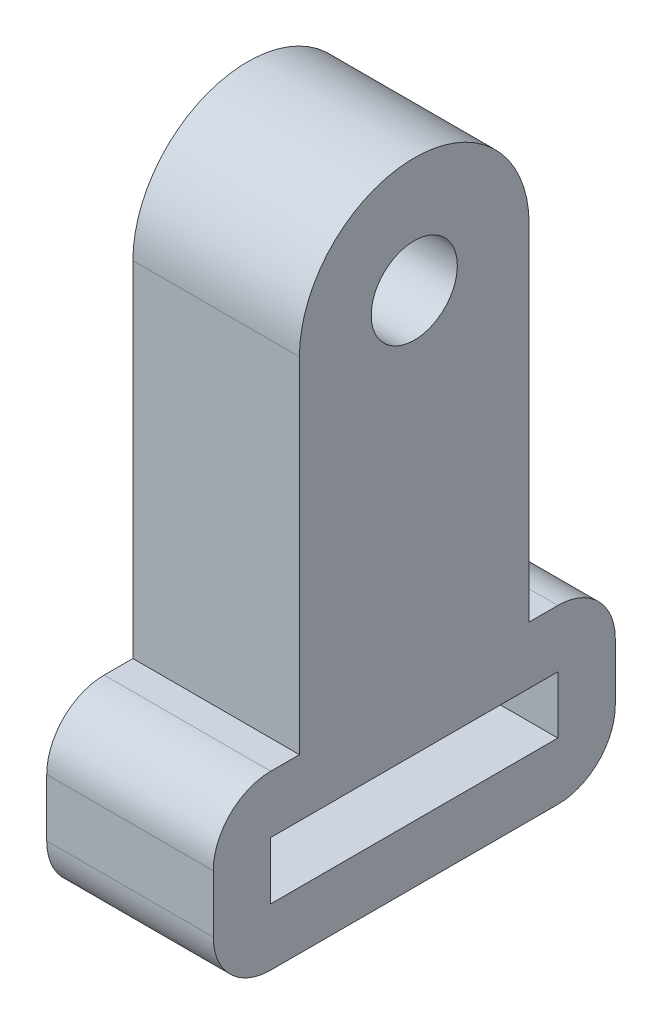
ISO-10303-21;
HEADER;
FILE_DESCRIPTION(('STEP AP214'),'2;1');
FILE_NAME('part.step','',(''),(''),'','','');
FILE_SCHEMA(('AUTOMOTIVE_DESIGN { 1 0 10303 214 1 1 1 1 }'));
ENDSEC;
DATA;
#1=APPLICATION_CONTEXT('core data for automotive mechanical design processes');
#2=APPLICATION_PROTOCOL_DEFINITION('international standard','automotive_design',2000,#1);
#3=PRODUCT_CONTEXT('',#1,'mechanical');
#4=PRODUCT('Part','Part','',(#3));
#5=PRODUCT_RELATED_PRODUCT_CATEGORY('part','',(#4));
#6=PRODUCT_DEFINITION_FORMATION('','',#4);
#7=PRODUCT_DEFINITION_CONTEXT('part definition',#1,'design');
#8=PRODUCT_DEFINITION('design','',#6,#7);
#9=PRODUCT_DEFINITION_SHAPE('','',#8);
#10=(LENGTH_UNIT() NAMED_UNIT(*) SI_UNIT(.MILLI.,.METRE.));
#11=(NAMED_UNIT(*) PLANE_ANGLE_UNIT() SI_UNIT($,.RADIAN.));
#12=(NAMED_UNIT(*) SI_UNIT($,.STERADIAN.) SOLID_ANGLE_UNIT());
#13=UNCERTAINTY_MEASURE_WITH_UNIT(LENGTH_MEASURE(1.E-05),#10,'distance_accuracy_value','');
#14=(GEOMETRIC_REPRESENTATION_CONTEXT(3) GLOBAL_UNCERTAINTY_ASSIGNED_CONTEXT((#13)) GLOBAL_UNIT_ASSIGNED_CONTEXT((#10,
#11,#12)) REPRESENTATION_CONTEXT('',''));
#15=CARTESIAN_POINT('',(0.,0.,0.));
#16=DIRECTION('',(0.,0.,1.));
#17=DIRECTION('',(1.,0.,0.));
#18=AXIS2_PLACEMENT_3D('',#15,#16,#17);
#19=CARTESIAN_POINT('',(2.9,-0.999999999999999,-5.));
#20=DIRECTION('',(1.,0.,0.));
#21=DIRECTION('',(0.,0.,-1.));
#22=AXIS2_PLACEMENT_3D('',#19,#20,#21);
#23=PLANE('',#22);
#24=DIRECTION('',(0.,0.,1.));
#25=VECTOR('',#24,1.);
#26=CARTESIAN_POINT('',(2.9,1.,5.));
#27=LINE('',#26,#25);
#28=CARTESIAN_POINT('',(2.9,1.,-5.));
#29=VERTEX_POINT('',#28);
#30=CARTESIAN_POINT('',(2.9,1.,5.));
#31=VERTEX_POINT('',#30);
#32=EDGE_CURVE('E154',#29,#31,#27,.T.);
#33=ORIENTED_EDGE('',*,*,#32,.F.);
#34=DIRECTION('',(0.,1.,0.));
#35=VECTOR('',#34,1.);
#36=CARTESIAN_POINT('',(2.9,1.,-5.));
#37=LINE('',#36,#35);
#38=CARTESIAN_POINT('',(2.9,-0.999999999999999,-5.));
#39=VERTEX_POINT('',#38);
#40=EDGE_CURVE('E146',#39,#29,#37,.T.);
#41=ORIENTED_EDGE('',*,*,#40,.F.);
#42=DIRECTION('',(0.,0.,-1.));
#43=VECTOR('',#42,1.);
#44=CARTESIAN_POINT('',(2.9,-1.,5.));
#45=LINE('',#44,#43);
#46=CARTESIAN_POINT('',(2.9,-1.,5.));
#47=VERTEX_POINT('',#46);
#48=EDGE_CURVE('E169',#47,#39,#45,.T.);
#49=ORIENTED_EDGE('',*,*,#48,.F.);
#50=DIRECTION('',(0.,-1.,0.));
#51=VECTOR('',#50,1.);
#52=CARTESIAN_POINT('',(2.9,1.,5.));
#53=LINE('',#52,#51);
#54=EDGE_CURVE('E167',#31,#47,#53,.T.);
#55=ORIENTED_EDGE('',*,*,#54,.F.);
#56=EDGE_LOOP('',(#33,#41,#49,#55));
#57=FACE_BOUND('',#56,.T.);
#58=CARTESIAN_POINT('',(2.9,-0.999999999999999,-5.));
#59=DIRECTION('',(1.,0.,0.));
#60=DIRECTION('',(0.,0.,-1.));
#61=AXIS2_PLACEMENT_3D('',#58,#59,#60);
#62=CIRCLE('',#61,2.);
#63=CARTESIAN_POINT('',(2.9,-3.,-5.));
#64=VERTEX_POINT('',#63);
#65=CARTESIAN_POINT('',(2.9,-0.999999999999999,-7.));
#66=VERTEX_POINT('',#65);
#67=EDGE_CURVE('E185',#64,#66,#62,.T.);
#68=ORIENTED_EDGE('',*,*,#67,.T.);
#69=DIRECTION('',(0.,1.,0.));
#70=VECTOR('',#69,1.);
#71=CARTESIAN_POINT('',(2.9,1.,-7.));
#72=LINE('',#71,#70);
#73=CARTESIAN_POINT('',(2.9,1.,-7.));
#74=VERTEX_POINT('',#73);
#75=EDGE_CURVE('E188',#66,#74,#72,.T.);
#76=ORIENTED_EDGE('',*,*,#75,.T.);
#77=CARTESIAN_POINT('',(2.9,1.,-5.));
#78=DIRECTION('',(1.,0.,0.));
#79=DIRECTION('',(0.,0.,1.));
#80=AXIS2_PLACEMENT_3D('',#77,#78,#79);
#81=CIRCLE('',#80,2.);
#82=CARTESIAN_POINT('',(2.9,3.,-5.));
#83=VERTEX_POINT('',#82);
#84=EDGE_CURVE('E191',#74,#83,#81,.T.);
#85=ORIENTED_EDGE('',*,*,#84,.T.);
#86=DIRECTION('',(0.,0.,1.));
#87=VECTOR('',#86,1.);
#88=CARTESIAN_POINT('',(2.9,3.,-4.));
#89=LINE('',#88,#87);
#90=CARTESIAN_POINT('',(2.9,3.,-4.));
#91=VERTEX_POINT('',#90);
#92=EDGE_CURVE('E193',#83,#91,#89,.T.);
#93=ORIENTED_EDGE('',*,*,#92,.T.);
#94=DIRECTION('',(0.,1.,0.));
#95=VECTOR('',#94,1.);
#96=CARTESIAN_POINT('',(2.9,15.,-4.));
#97=LINE('',#96,#95);
#98=CARTESIAN_POINT('',(2.9,15.,-4.));
#99=VERTEX_POINT('',#98);
#100=EDGE_CURVE('E195',#91,#99,#97,.T.);
#101=ORIENTED_EDGE('',*,*,#100,.T.);
#102=CARTESIAN_POINT('',(2.9,15.,0.));
#103=DIRECTION('',(1.,0.,0.));
#104=DIRECTION('',(0.,0.,-1.));
#105=AXIS2_PLACEMENT_3D('',#102,#103,#104);
#106=CIRCLE('',#105,4.);
#107=CARTESIAN_POINT('',(2.9,15.,4.));
#108=VERTEX_POINT('',#107);
#109=EDGE_CURVE('E197',#99,#108,#106,.T.);
#110=ORIENTED_EDGE('',*,*,#109,.T.);
#111=DIRECTION('',(0.,-1.,0.));
#112=VECTOR('',#111,1.);
#113=CARTESIAN_POINT('',(2.9,15.,4.));
#114=LINE('',#113,#112);
#115=CARTESIAN_POINT('',(2.9,3.,4.));
#116=VERTEX_POINT('',#115);
#117=EDGE_CURVE('E199',#108,#116,#114,.T.);
#118=ORIENTED_EDGE('',*,*,#117,.T.);
#119=DIRECTION('',(0.,0.,1.));
#120=VECTOR('',#119,1.);
#121=CARTESIAN_POINT('',(2.9,3.,4.));
#122=LINE('',#121,#120);
#123=CARTESIAN_POINT('',(2.9,3.,5.));
#124=VERTEX_POINT('',#123);
#125=EDGE_CURVE('E201',#116,#124,#122,.T.);
#126=ORIENTED_EDGE('',*,*,#125,.T.);
#127=CARTESIAN_POINT('',(2.9,1.,5.));
#128=DIRECTION('',(1.,0.,0.));
#129=DIRECTION('',(0.,0.,-1.));
#130=AXIS2_PLACEMENT_3D('',#127,#128,#129);
#131=CIRCLE('',#130,2.);
#132=CARTESIAN_POINT('',(2.9,1.,7.));
#133=VERTEX_POINT('',#132);
#134=EDGE_CURVE('E203',#124,#133,#131,.T.);
#135=ORIENTED_EDGE('',*,*,#134,.T.);
#136=DIRECTION('',(0.,-1.,0.));
#137=VECTOR('',#136,1.);
#138=CARTESIAN_POINT('',(2.9,1.,7.));
#139=LINE('',#138,#137);
#140=CARTESIAN_POINT('',(2.9,-0.999999999999999,7.));
#141=VERTEX_POINT('',#140);
#142=EDGE_CURVE('E205',#133,#141,#139,.T.);
#143=ORIENTED_EDGE('',*,*,#142,.T.);
#144=CARTESIAN_POINT('',(2.9,-0.999999999999999,5.));
#145=DIRECTION('',(1.,0.,0.));
#146=DIRECTION('',(0.,0.,-1.));
#147=AXIS2_PLACEMENT_3D('',#144,#145,#146);
#148=CIRCLE('',#147,2.);
#149=CARTESIAN_POINT('',(2.9,-3.,5.));
#150=VERTEX_POINT('',#149);
#151=EDGE_CURVE('E207',#141,#150,#148,.T.);
#152=ORIENTED_EDGE('',*,*,#151,.T.);
#153=DIRECTION('',(0.,0.,-1.));
#154=VECTOR('',#153,1.);
#155=CARTESIAN_POINT('',(2.9,-3.,5.));
#156=LINE('',#155,#154);
#157=EDGE_CURVE('E209',#150,#64,#156,.T.);
#158=ORIENTED_EDGE('',*,*,#157,.T.);
#159=EDGE_LOOP('',(#68,#76,#85,#93,#101,#110,#118,#126,#135,#143,#152,#158));
#160=FACE_BOUND('',#159,.T.);
#161=CARTESIAN_POINT('',(2.9,15.,0.));
#162=DIRECTION('',(1.,0.,0.));
#163=DIRECTION('',(0.,0.,-1.));
#164=AXIS2_PLACEMENT_3D('',#161,#162,#163);
#165=CIRCLE('',#164,1.5);
#166=CARTESIAN_POINT('',(2.9,15.,-1.5));
#167=VERTEX_POINT('',#166);
#168=EDGE_CURVE('E175',#167,#167,#165,.T.);
#169=ORIENTED_EDGE('',*,*,#168,.F.);
#170=EDGE_LOOP('',(#169));
#171=FACE_BOUND('',#170,.T.);
#172=ADVANCED_FACE('F33',(#57,#160,#171),#23,.T.);
#173=CARTESIAN_POINT('',(-2.9,-0.999999999999999,-5.));
#174=DIRECTION('',(1.,0.,0.));
#175=DIRECTION('',(0.,0.,-1.));
#176=AXIS2_PLACEMENT_3D('',#173,#174,#175);
#177=PLANE('',#176);
#178=CARTESIAN_POINT('',(-2.9,-0.999999999999999,-5.));
#179=DIRECTION('',(1.,0.,0.));
#180=DIRECTION('',(0.,0.,-1.));
#181=AXIS2_PLACEMENT_3D('',#178,#179,#180);
#182=CIRCLE('',#181,2.);
#183=CARTESIAN_POINT('',(-2.9,-3.,-5.));
#184=VERTEX_POINT('',#183);
#185=CARTESIAN_POINT('',(-2.9,-0.999999999999999,-7.));
#186=VERTEX_POINT('',#185);
#187=EDGE_CURVE('E162',#184,#186,#182,.T.);
#188=ORIENTED_EDGE('',*,*,#187,.F.);
#189=DIRECTION('',(0.,0.,-1.));
#190=VECTOR('',#189,1.);
#191=CARTESIAN_POINT('',(-2.9,-3.,5.));
#192=LINE('',#191,#190);
#193=CARTESIAN_POINT('',(-2.9,-3.,5.));
#194=VERTEX_POINT('',#193);
#195=EDGE_CURVE('E189',#194,#184,#192,.T.);
#196=ORIENTED_EDGE('',*,*,#195,.F.);
#197=CARTESIAN_POINT('',(-2.9,-0.999999999999999,5.));
#198=DIRECTION('',(1.,0.,0.));
#199=DIRECTION('',(0.,0.,-1.));
#200=AXIS2_PLACEMENT_3D('',#197,#198,#199);
#201=CIRCLE('',#200,2.);
#202=CARTESIAN_POINT('',(-2.9,-0.999999999999999,7.));
#203=VERTEX_POINT('',#202);
#204=EDGE_CURVE('E232',#203,#194,#201,.T.);
#205=ORIENTED_EDGE('',*,*,#204,.F.);
#206=DIRECTION('',(0.,-1.,0.));
#207=VECTOR('',#206,1.);
#208=CARTESIAN_POINT('',(-2.9,1.,7.));
#209=LINE('',#208,#207);
#210=CARTESIAN_POINT('',(-2.9,1.,7.));
#211=VERTEX_POINT('',#210);
#212=EDGE_CURVE('E230',#211,#203,#209,.T.);
#213=ORIENTED_EDGE('',*,*,#212,.F.);
#214=CARTESIAN_POINT('',(-2.9,1.,5.));
#215=DIRECTION('',(1.,0.,0.));
#216=DIRECTION('',(0.,0.,-1.));
#217=AXIS2_PLACEMENT_3D('',#214,#215,#216);
#218=CIRCLE('',#217,2.);
#219=CARTESIAN_POINT('',(-2.9,3.,5.));
#220=VERTEX_POINT('',#219);
#221=EDGE_CURVE('E228',#220,#211,#218,.T.);
#222=ORIENTED_EDGE('',*,*,#221,.F.);
#223=DIRECTION('',(0.,0.,1.));
#224=VECTOR('',#223,1.);
#225=CARTESIAN_POINT('',(-2.9,3.,4.));
#226=LINE('',#225,#224);
#227=CARTESIAN_POINT('',(-2.9,3.,4.));
#228=VERTEX_POINT('',#227);
#229=EDGE_CURVE('E226',#228,#220,#226,.T.);
#230=ORIENTED_EDGE('',*,*,#229,.F.);
#231=DIRECTION('',(0.,-1.,0.));
#232=VECTOR('',#231,1.);
#233=CARTESIAN_POINT('',(-2.9,15.,4.));
#234=LINE('',#233,#232);
#235=CARTESIAN_POINT('',(-2.9,15.,4.));
#236=VERTEX_POINT('',#235);
#237=EDGE_CURVE('E224',#236,#228,#234,.T.);
#238=ORIENTED_EDGE('',*,*,#237,.F.);
#239=CARTESIAN_POINT('',(-2.9,15.,0.));
#240=DIRECTION('',(1.,0.,0.));
#241=DIRECTION('',(0.,0.,-1.));
#242=AXIS2_PLACEMENT_3D('',#239,#240,#241);
#243=CIRCLE('',#242,4.);
#244=CARTESIAN_POINT('',(-2.9,15.,-4.));
#245=VERTEX_POINT('',#244);
#246=EDGE_CURVE('E222',#245,#236,#243,.T.);
#247=ORIENTED_EDGE('',*,*,#246,.F.);
#248=DIRECTION('',(0.,1.,0.));
#249=VECTOR('',#248,1.);
#250=CARTESIAN_POINT('',(-2.9,15.,-4.));
#251=LINE('',#250,#249);
#252=CARTESIAN_POINT('',(-2.9,3.,-4.));
#253=VERTEX_POINT('',#252);
#254=EDGE_CURVE('E220',#253,#245,#251,.T.);
#255=ORIENTED_EDGE('',*,*,#254,.F.);
#256=DIRECTION('',(0.,0.,1.));
#257=VECTOR('',#256,1.);
#258=CARTESIAN_POINT('',(-2.9,3.,-4.));
#259=LINE('',#258,#257);
#260=CARTESIAN_POINT('',(-2.9,3.,-5.));
#261=VERTEX_POINT('',#260);
#262=EDGE_CURVE('E218',#261,#253,#259,.T.);
#263=ORIENTED_EDGE('',*,*,#262,.F.);
#264=CARTESIAN_POINT('',(-2.9,1.,-5.));
#265=DIRECTION('',(1.,0.,0.));
#266=DIRECTION('',(0.,0.,1.));
#267=AXIS2_PLACEMENT_3D('',#264,#265,#266);
#268=CIRCLE('',#267,2.);
#269=CARTESIAN_POINT('',(-2.9,1.,-7.));
#270=VERTEX_POINT('',#269);
#271=EDGE_CURVE('E216',#270,#261,#268,.T.);
#272=ORIENTED_EDGE('',*,*,#271,.F.);
#273=DIRECTION('',(0.,1.,0.));
#274=VECTOR('',#273,1.);
#275=CARTESIAN_POINT('',(-2.9,1.,-7.));
#276=LINE('',#275,#274);
#277=EDGE_CURVE('E214',#186,#270,#276,.T.);
#278=ORIENTED_EDGE('',*,*,#277,.F.);
#279=EDGE_LOOP('',(#188,#196,#205,#213,#222,#230,#238,#247,#255,#263,#272,#278));
#280=FACE_BOUND('',#279,.T.);
#281=DIRECTION('',(0.,1.,0.));
#282=VECTOR('',#281,1.);
#283=CARTESIAN_POINT('',(-2.9,1.,-5.));
#284=LINE('',#283,#282);
#285=CARTESIAN_POINT('',(-2.9,-0.999999999999999,-5.));
#286=VERTEX_POINT('',#285);
#287=CARTESIAN_POINT('',(-2.9,1.,-5.));
#288=VERTEX_POINT('',#287);
#289=EDGE_CURVE('E56',#286,#288,#284,.T.);
#290=ORIENTED_EDGE('',*,*,#289,.T.);
#291=DIRECTION('',(0.,0.,1.));
#292=VECTOR('',#291,1.);
#293=CARTESIAN_POINT('',(-2.9,1.,5.));
#294=LINE('',#293,#292);
#295=CARTESIAN_POINT('',(-2.9,1.,5.));
#296=VERTEX_POINT('',#295);
#297=EDGE_CURVE('E161',#288,#296,#294,.T.);
#298=ORIENTED_EDGE('',*,*,#297,.T.);
#299=DIRECTION('',(0.,-1.,0.));
#300=VECTOR('',#299,1.);
#301=CARTESIAN_POINT('',(-2.9,1.,5.));
#302=LINE('',#301,#300);
#303=CARTESIAN_POINT('',(-2.9,-1.,5.));
#304=VERTEX_POINT('',#303);
#305=EDGE_CURVE('E177',#296,#304,#302,.T.);
#306=ORIENTED_EDGE('',*,*,#305,.T.);
#307=DIRECTION('',(0.,0.,-1.));
#308=VECTOR('',#307,1.);
#309=CARTESIAN_POINT('',(-2.9,-1.,5.));
#310=LINE('',#309,#308);
#311=EDGE_CURVE('E155',#304,#286,#310,.T.);
#312=ORIENTED_EDGE('',*,*,#311,.T.);
#313=EDGE_LOOP('',(#290,#298,#306,#312));
#314=FACE_BOUND('',#313,.T.);
#315=CARTESIAN_POINT('',(-2.9,15.,0.));
#316=DIRECTION('',(1.,0.,0.));
#317=DIRECTION('',(0.,0.,-1.));
#318=AXIS2_PLACEMENT_3D('',#315,#316,#317);
#319=CIRCLE('',#318,1.5);
#320=CARTESIAN_POINT('',(-2.9,15.,-1.5));
#321=VERTEX_POINT('',#320);
#322=EDGE_CURVE('E485',#321,#321,#319,.T.);
#323=ORIENTED_EDGE('',*,*,#322,.T.);
#324=EDGE_LOOP('',(#323));
#325=FACE_BOUND('',#324,.T.);
#326=ADVANCED_FACE('F274',(#280,#314,#325),#177,.F.);
#327=CARTESIAN_POINT('',(2.9,-0.999999999999999,-5.));
#328=DIRECTION('',(-1.,0.,0.));
#329=DIRECTION('',(0.,0.,1.));
#330=AXIS2_PLACEMENT_3D('',#327,#328,#329);
#331=CYLINDRICAL_SURFACE('',#330,2.);
#332=ORIENTED_EDGE('',*,*,#187,.T.);
#333=DIRECTION('',(-1.,0.,0.));
#334=VECTOR('',#333,1.);
#335=CARTESIAN_POINT('',(2.9,-0.999999999999999,-7.));
#336=LINE('',#335,#334);
#337=EDGE_CURVE('E11',#66,#186,#336,.T.);
#338=ORIENTED_EDGE('',*,*,#337,.F.);
#339=ORIENTED_EDGE('',*,*,#67,.F.);
#340=DIRECTION('',(-1.,0.,0.));
#341=VECTOR('',#340,1.);
#342=CARTESIAN_POINT('',(2.9,-3.,-5.));
#343=LINE('',#342,#341);
#344=EDGE_CURVE('E211',#64,#184,#343,.T.);
#345=ORIENTED_EDGE('',*,*,#344,.T.);
#346=EDGE_LOOP('',(#332,#338,#339,#345));
#347=FACE_BOUND('',#346,.T.);
#348=ADVANCED_FACE('F35',(#347),#331,.T.);
#349=CARTESIAN_POINT('',(2.9,1.,-7.));
#350=DIRECTION('',(0.,0.,1.));
#351=DIRECTION('',(0.,-1.,0.));
#352=AXIS2_PLACEMENT_3D('',#349,#350,#351);
#353=PLANE('',#352);
#354=ORIENTED_EDGE('',*,*,#277,.T.);
#355=DIRECTION('',(-1.,0.,0.));
#356=VECTOR('',#355,1.);
#357=CARTESIAN_POINT('',(2.9,1.,-7.));
#358=LINE('',#357,#356);
#359=EDGE_CURVE('E41',#74,#270,#358,.T.);
#360=ORIENTED_EDGE('',*,*,#359,.F.);
#361=ORIENTED_EDGE('',*,*,#75,.F.);
#362=ORIENTED_EDGE('',*,*,#337,.T.);
#363=EDGE_LOOP('',(#354,#360,#361,#362));
#364=FACE_BOUND('',#363,.T.);
#365=ADVANCED_FACE('F291',(#364),#353,.F.);
#366=CARTESIAN_POINT('',(2.9,1.,-5.));
#367=DIRECTION('',(-1.,0.,0.));
#368=DIRECTION('',(0.,0.,1.));
#369=AXIS2_PLACEMENT_3D('',#366,#367,#368);
#370=CYLINDRICAL_SURFACE('',#369,2.);
#371=ORIENTED_EDGE('',*,*,#271,.T.);
#372=DIRECTION('',(-1.,0.,0.));
#373=VECTOR('',#372,1.);
#374=CARTESIAN_POINT('',(2.9,3.,-5.));
#375=LINE('',#374,#373);
#376=EDGE_CURVE('E261',#83,#261,#375,.T.);
#377=ORIENTED_EDGE('',*,*,#376,.F.);
#378=ORIENTED_EDGE('',*,*,#84,.F.);
#379=ORIENTED_EDGE('',*,*,#359,.T.);
#380=EDGE_LOOP('',(#371,#377,#378,#379));
#381=FACE_BOUND('',#380,.T.);
#382=ADVANCED_FACE('F268',(#381),#370,.T.);
#383=CARTESIAN_POINT('',(2.9,3.,-4.));
#384=DIRECTION('',(0.,-1.,0.));
#385=DIRECTION('',(0.,0.,-1.));
#386=AXIS2_PLACEMENT_3D('',#383,#384,#385);
#387=PLANE('',#386);
#388=ORIENTED_EDGE('',*,*,#262,.T.);
#389=DIRECTION('',(-1.,0.,0.));
#390=VECTOR('',#389,1.);
#391=CARTESIAN_POINT('',(2.9,3.,-4.));
#392=LINE('',#391,#390);
#393=EDGE_CURVE('E258',#91,#253,#392,.T.);
#394=ORIENTED_EDGE('',*,*,#393,.F.);
#395=ORIENTED_EDGE('',*,*,#92,.F.);
#396=ORIENTED_EDGE('',*,*,#376,.T.);
#397=EDGE_LOOP('',(#388,#394,#395,#396));
#398=FACE_BOUND('',#397,.T.);
#399=ADVANCED_FACE('F280',(#398),#387,.F.);
#400=CARTESIAN_POINT('',(2.9,15.,-4.));
#401=DIRECTION('',(0.,0.,1.));
#402=DIRECTION('',(0.,-1.,0.));
#403=AXIS2_PLACEMENT_3D('',#400,#401,#402);
#404=PLANE('',#403);
#405=ORIENTED_EDGE('',*,*,#254,.T.);
#406=DIRECTION('',(-1.,0.,0.));
#407=VECTOR('',#406,1.);
#408=CARTESIAN_POINT('',(2.9,15.,-4.));
#409=LINE('',#408,#407);
#410=EDGE_CURVE('E255',#99,#245,#409,.T.);
#411=ORIENTED_EDGE('',*,*,#410,.F.);
#412=ORIENTED_EDGE('',*,*,#100,.F.);
#413=ORIENTED_EDGE('',*,*,#393,.T.);
#414=EDGE_LOOP('',(#405,#411,#412,#413));
#415=FACE_BOUND('',#414,.T.);
#416=ADVANCED_FACE('F284',(#415),#404,.F.);
#417=CARTESIAN_POINT('',(2.9,15.,0.));
#418=DIRECTION('',(-1.,0.,0.));
#419=DIRECTION('',(0.,0.,1.));
#420=AXIS2_PLACEMENT_3D('',#417,#418,#419);
#421=CYLINDRICAL_SURFACE('',#420,4.);
#422=ORIENTED_EDGE('',*,*,#246,.T.);
#423=DIRECTION('',(-1.,0.,0.));
#424=VECTOR('',#423,1.);
#425=CARTESIAN_POINT('',(2.9,15.,4.));
#426=LINE('',#425,#424);
#427=EDGE_CURVE('E252',#108,#236,#426,.T.);
#428=ORIENTED_EDGE('',*,*,#427,.F.);
#429=ORIENTED_EDGE('',*,*,#109,.F.);
#430=ORIENTED_EDGE('',*,*,#410,.T.);
#431=EDGE_LOOP('',(#422,#428,#429,#430));
#432=FACE_BOUND('',#431,.T.);
#433=ADVANCED_FACE('F324',(#432),#421,.T.);
#434=CARTESIAN_POINT('',(2.9,15.,4.));
#435=DIRECTION('',(0.,0.,-1.));
#436=DIRECTION('',(0.,1.,0.));
#437=AXIS2_PLACEMENT_3D('',#434,#435,#436);
#438=PLANE('',#437);
#439=ORIENTED_EDGE('',*,*,#237,.T.);
#440=DIRECTION('',(-1.,0.,0.));
#441=VECTOR('',#440,1.);
#442=CARTESIAN_POINT('',(2.9,3.,4.));
#443=LINE('',#442,#441);
#444=EDGE_CURVE('E249',#116,#228,#443,.T.);
#445=ORIENTED_EDGE('',*,*,#444,.F.);
#446=ORIENTED_EDGE('',*,*,#117,.F.);
#447=ORIENTED_EDGE('',*,*,#427,.T.);
#448=EDGE_LOOP('',(#439,#445,#446,#447));
#449=FACE_BOUND('',#448,.T.);
#450=ADVANCED_FACE('F322',(#449),#438,.F.);
#451=CARTESIAN_POINT('',(2.9,3.,4.));
#452=DIRECTION('',(0.,-1.,0.));
#453=DIRECTION('',(0.,0.,-1.));
#454=AXIS2_PLACEMENT_3D('',#451,#452,#453);
#455=PLANE('',#454);
#456=ORIENTED_EDGE('',*,*,#229,.T.);
#457=DIRECTION('',(-1.,0.,0.));
#458=VECTOR('',#457,1.);
#459=CARTESIAN_POINT('',(2.9,3.,5.));
#460=LINE('',#459,#458);
#461=EDGE_CURVE('E246',#124,#220,#460,.T.);
#462=ORIENTED_EDGE('',*,*,#461,.F.);
#463=ORIENTED_EDGE('',*,*,#125,.F.);
#464=ORIENTED_EDGE('',*,*,#444,.T.);
#465=EDGE_LOOP('',(#456,#462,#463,#464));
#466=FACE_BOUND('',#465,.T.);
#467=ADVANCED_FACE('F318',(#466),#455,.F.);
#468=CARTESIAN_POINT('',(2.9,1.,5.));
#469=DIRECTION('',(-1.,0.,0.));
#470=DIRECTION('',(0.,0.,1.));
#471=AXIS2_PLACEMENT_3D('',#468,#469,#470);
#472=CYLINDRICAL_SURFACE('',#471,2.);
#473=ORIENTED_EDGE('',*,*,#221,.T.);
#474=DIRECTION('',(-1.,0.,0.));
#475=VECTOR('',#474,1.);
#476=CARTESIAN_POINT('',(2.9,1.,7.));
#477=LINE('',#476,#475);
#478=EDGE_CURVE('E243',#133,#211,#477,.T.);
#479=ORIENTED_EDGE('',*,*,#478,.F.);
#480=ORIENTED_EDGE('',*,*,#134,.F.);
#481=ORIENTED_EDGE('',*,*,#461,.T.);
#482=EDGE_LOOP('',(#473,#479,#480,#481));
#483=FACE_BOUND('',#482,.T.);
#484=ADVANCED_FACE('F313',(#483),#472,.T.);
#485=CARTESIAN_POINT('',(2.9,1.,7.));
#486=DIRECTION('',(0.,0.,-1.));
#487=DIRECTION('',(0.,1.,0.));
#488=AXIS2_PLACEMENT_3D('',#485,#486,#487);
#489=PLANE('',#488);
#490=ORIENTED_EDGE('',*,*,#212,.T.);
#491=DIRECTION('',(-1.,0.,0.));
#492=VECTOR('',#491,1.);
#493=CARTESIAN_POINT('',(2.9,-0.999999999999999,7.));
#494=LINE('',#493,#492);
#495=EDGE_CURVE('E240',#141,#203,#494,.T.);
#496=ORIENTED_EDGE('',*,*,#495,.F.);
#497=ORIENTED_EDGE('',*,*,#142,.F.);
#498=ORIENTED_EDGE('',*,*,#478,.T.);
#499=EDGE_LOOP('',(#490,#496,#497,#498));
#500=FACE_BOUND('',#499,.T.);
#501=ADVANCED_FACE('F307',(#500),#489,.F.);
#502=CARTESIAN_POINT('',(2.9,-0.999999999999999,5.));
#503=DIRECTION('',(-1.,0.,0.));
#504=DIRECTION('',(0.,0.,1.));
#505=AXIS2_PLACEMENT_3D('',#502,#503,#504);
#506=CYLINDRICAL_SURFACE('',#505,2.);
#507=ORIENTED_EDGE('',*,*,#204,.T.);
#508=DIRECTION('',(-1.,0.,0.));
#509=VECTOR('',#508,1.);
#510=CARTESIAN_POINT('',(2.9,-3.,5.));
#511=LINE('',#510,#509);
#512=EDGE_CURVE('E237',#150,#194,#511,.T.);
#513=ORIENTED_EDGE('',*,*,#512,.F.);
#514=ORIENTED_EDGE('',*,*,#151,.F.);
#515=ORIENTED_EDGE('',*,*,#495,.T.);
#516=EDGE_LOOP('',(#507,#513,#514,#515));
#517=FACE_BOUND('',#516,.T.);
#518=ADVANCED_FACE('F303',(#517),#506,.T.);
#519=CARTESIAN_POINT('',(2.9,-3.,5.));
#520=DIRECTION('',(0.,1.,0.));
#521=DIRECTION('',(0.,0.,1.));
#522=AXIS2_PLACEMENT_3D('',#519,#520,#521);
#523=PLANE('',#522);
#524=ORIENTED_EDGE('',*,*,#195,.T.);
#525=ORIENTED_EDGE('',*,*,#344,.F.);
#526=ORIENTED_EDGE('',*,*,#157,.F.);
#527=ORIENTED_EDGE('',*,*,#512,.T.);
#528=EDGE_LOOP('',(#524,#525,#526,#527));
#529=FACE_BOUND('',#528,.T.);
#530=ADVANCED_FACE('F298',(#529),#523,.F.);
#531=CARTESIAN_POINT('',(2.9,1.,-5.));
#532=DIRECTION('',(0.,0.,1.));
#533=DIRECTION('',(1.,0.,0.));
#534=AXIS2_PLACEMENT_3D('',#531,#532,#533);
#535=PLANE('',#534);
#536=ORIENTED_EDGE('',*,*,#289,.F.);
#537=DIRECTION('',(-1.,0.,0.));
#538=VECTOR('',#537,1.);
#539=CARTESIAN_POINT('',(2.9,-0.999999999999999,-5.));
#540=LINE('',#539,#538);
#541=EDGE_CURVE('E150',#39,#286,#540,.T.);
#542=ORIENTED_EDGE('',*,*,#541,.F.);
#543=ORIENTED_EDGE('',*,*,#40,.T.);
#544=DIRECTION('',(-1.,0.,0.));
#545=VECTOR('',#544,1.);
#546=CARTESIAN_POINT('',(2.9,1.,-5.));
#547=LINE('',#546,#545);
#548=EDGE_CURVE('E149',#29,#288,#547,.T.);
#549=ORIENTED_EDGE('',*,*,#548,.T.);
#550=EDGE_LOOP('',(#536,#542,#543,#549));
#551=FACE_BOUND('',#550,.T.);
#552=ADVANCED_FACE('F148',(#551),#535,.T.);
#553=CARTESIAN_POINT('',(2.9,1.,5.));
#554=DIRECTION('',(0.,-1.,0.));
#555=DIRECTION('',(0.,0.,-1.));
#556=AXIS2_PLACEMENT_3D('',#553,#554,#555);
#557=PLANE('',#556);
#558=ORIENTED_EDGE('',*,*,#297,.F.);
#559=ORIENTED_EDGE('',*,*,#548,.F.);
#560=ORIENTED_EDGE('',*,*,#32,.T.);
#561=DIRECTION('',(-1.,0.,0.));
#562=VECTOR('',#561,1.);
#563=CARTESIAN_POINT('',(2.9,1.,5.));
#564=LINE('',#563,#562);
#565=EDGE_CURVE('E163',#31,#296,#564,.T.);
#566=ORIENTED_EDGE('',*,*,#565,.T.);
#567=EDGE_LOOP('',(#558,#559,#560,#566));
#568=FACE_BOUND('',#567,.T.);
#569=ADVANCED_FACE('F158',(#568),#557,.T.);
#570=CARTESIAN_POINT('',(2.9,1.,5.));
#571=DIRECTION('',(0.,0.,-1.));
#572=DIRECTION('',(-1.,0.,0.));
#573=AXIS2_PLACEMENT_3D('',#570,#571,#572);
#574=PLANE('',#573);
#575=ORIENTED_EDGE('',*,*,#305,.F.);
#576=ORIENTED_EDGE('',*,*,#565,.F.);
#577=ORIENTED_EDGE('',*,*,#54,.T.);
#578=DIRECTION('',(-1.,0.,0.));
#579=VECTOR('',#578,1.);
#580=CARTESIAN_POINT('',(2.9,-1.,5.));
#581=LINE('',#580,#579);
#582=EDGE_CURVE('E48',#47,#304,#581,.T.);
#583=ORIENTED_EDGE('',*,*,#582,.T.);
#584=EDGE_LOOP('',(#575,#576,#577,#583));
#585=FACE_BOUND('',#584,.T.);
#586=ADVANCED_FACE('F382',(#585),#574,.T.);
#587=CARTESIAN_POINT('',(2.9,-1.,5.));
#588=DIRECTION('',(0.,1.,0.));
#589=DIRECTION('',(0.,0.,1.));
#590=AXIS2_PLACEMENT_3D('',#587,#588,#589);
#591=PLANE('',#590);
#592=ORIENTED_EDGE('',*,*,#311,.F.);
#593=ORIENTED_EDGE('',*,*,#582,.F.);
#594=ORIENTED_EDGE('',*,*,#48,.T.);
#595=ORIENTED_EDGE('',*,*,#541,.T.);
#596=EDGE_LOOP('',(#592,#593,#594,#595));
#597=FACE_BOUND('',#596,.T.);
#598=ADVANCED_FACE('F388',(#597),#591,.T.);
#599=CARTESIAN_POINT('',(2.9,15.,0.));
#600=DIRECTION('',(-1.,0.,0.));
#601=DIRECTION('',(0.,0.,1.));
#602=AXIS2_PLACEMENT_3D('',#599,#600,#601);
#603=CYLINDRICAL_SURFACE('',#602,1.5);
#604=ORIENTED_EDGE('',*,*,#168,.T.);
#605=EDGE_LOOP('',(#604));
#606=FACE_BOUND('',#605,.T.);
#607=ORIENTED_EDGE('',*,*,#322,.F.);
#608=EDGE_LOOP('',(#607));
#609=FACE_BOUND('',#608,.T.);
#610=ADVANCED_FACE('F396',(#606,#609),#603,.F.);
#611=CLOSED_SHELL('',(#172,#326,#348,#365,#382,#399,#416,#433,#450,#467,#484,#501,#518,#530,
#552,#569,#586,#598,#610));
#612=MANIFOLD_SOLID_BREP('B2',#611);
#613=ADVANCED_BREP_SHAPE_REPRESENTATION('',(#18,#612),#14);
#614=SHAPE_DEFINITION_REPRESENTATION(#9,#613);
ENDSEC;
END-ISO-10303-21;
